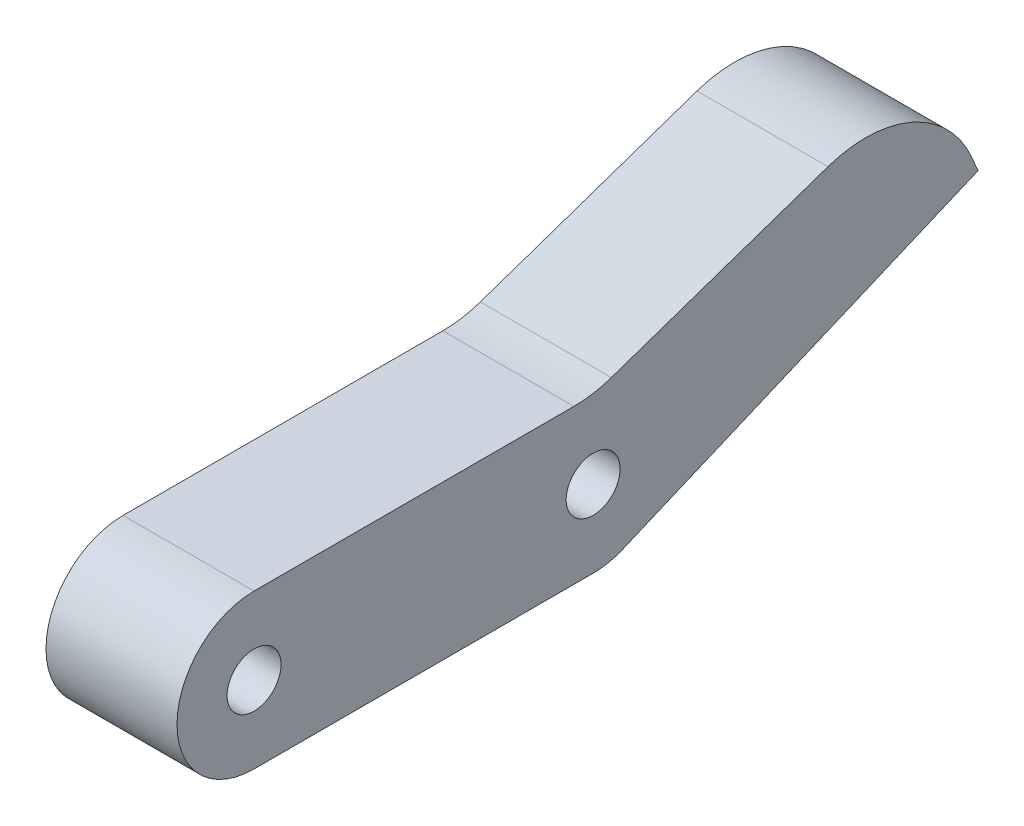
ISO-10303-21;
HEADER;
FILE_DESCRIPTION(('STEP AP214'),'2;1');
FILE_NAME('part.step','',(''),(''),'','','');
FILE_SCHEMA(('AUTOMOTIVE_DESIGN { 1 0 10303 214 1 1 1 1 }'));
ENDSEC;
DATA;
#1=APPLICATION_CONTEXT('core data for automotive mechanical design processes');
#2=APPLICATION_PROTOCOL_DEFINITION('international standard','automotive_design',2000,#1);
#3=PRODUCT_CONTEXT('',#1,'mechanical');
#4=PRODUCT('Part','Part','',(#3));
#5=PRODUCT_RELATED_PRODUCT_CATEGORY('part','',(#4));
#6=PRODUCT_DEFINITION_FORMATION('','',#4);
#7=PRODUCT_DEFINITION_CONTEXT('part definition',#1,'design');
#8=PRODUCT_DEFINITION('design','',#6,#7);
#9=PRODUCT_DEFINITION_SHAPE('','',#8);
#10=(LENGTH_UNIT() NAMED_UNIT(*) SI_UNIT(.MILLI.,.METRE.));
#11=(NAMED_UNIT(*) PLANE_ANGLE_UNIT() SI_UNIT($,.RADIAN.));
#12=(NAMED_UNIT(*) SI_UNIT($,.STERADIAN.) SOLID_ANGLE_UNIT());
#13=UNCERTAINTY_MEASURE_WITH_UNIT(LENGTH_MEASURE(1.E-05),#10,'distance_accuracy_value','');
#14=(GEOMETRIC_REPRESENTATION_CONTEXT(3) GLOBAL_UNCERTAINTY_ASSIGNED_CONTEXT((#13)) GLOBAL_UNIT_ASSIGNED_CONTEXT((#10,
#11,#12)) REPRESENTATION_CONTEXT('',''));
#15=CARTESIAN_POINT('',(0.,0.,0.));
#16=DIRECTION('',(0.,0.,1.));
#17=DIRECTION('',(1.,0.,0.));
#18=AXIS2_PLACEMENT_3D('',#15,#16,#17);
#19=CARTESIAN_POINT('',(8.5,5.,-27.));
#20=DIRECTION('',(-1.,0.,0.));
#21=DIRECTION('',(0.,0.,1.));
#22=AXIS2_PLACEMENT_3D('',#19,#20,#21);
#23=CYLINDRICAL_SURFACE('',#22,5.);
#24=DIRECTION('',(1.,0.,0.));
#25=VECTOR('',#24,1.);
#26=CARTESIAN_POINT('',(-30.2694405121752,0.394752402179554,-28.9472274039693));
#27=LINE('',#26,#25);
#28=CARTESIAN_POINT('',(0.,0.394752402179553,-28.9472274039693));
#29=VERTEX_POINT('',#28);
#30=CARTESIAN_POINT('',(8.5,0.394752402179553,-28.9472274039693));
#31=VERTEX_POINT('',#30);
#32=EDGE_CURVE('E134',#29,#31,#27,.T.);
#33=ORIENTED_EDGE('',*,*,#32,.T.);
#34=CARTESIAN_POINT('',(8.5,5.,-27.));
#35=DIRECTION('',(1.,0.,0.));
#36=DIRECTION('',(0.,0.,-1.));
#37=AXIS2_PLACEMENT_3D('',#34,#35,#36);
#38=CIRCLE('',#37,5.);
#39=CARTESIAN_POINT('',(8.5,0.,-27.));
#40=VERTEX_POINT('',#39);
#41=EDGE_CURVE('E150',#40,#31,#38,.T.);
#42=ORIENTED_EDGE('',*,*,#41,.F.);
#43=DIRECTION('',(-1.,0.,0.));
#44=VECTOR('',#43,1.);
#45=CARTESIAN_POINT('',(8.5,0.,-27.));
#46=LINE('',#45,#44);
#47=CARTESIAN_POINT('',(0.,0.,-27.));
#48=VERTEX_POINT('',#47);
#49=EDGE_CURVE('E184',#40,#48,#46,.T.);
#50=ORIENTED_EDGE('',*,*,#49,.T.);
#51=CARTESIAN_POINT('',(0.,5.,-27.));
#52=DIRECTION('',(1.,0.,0.));
#53=DIRECTION('',(0.,0.,-1.));
#54=AXIS2_PLACEMENT_3D('',#51,#52,#53);
#55=CIRCLE('',#54,5.);
#56=EDGE_CURVE('E193',#48,#29,#55,.T.);
#57=ORIENTED_EDGE('',*,*,#56,.T.);
#58=EDGE_LOOP('',(#33,#42,#50,#57));
#59=FACE_BOUND('',#58,.T.);
#60=ADVANCED_FACE('F47',(#59),#23,.T.);
#61=CARTESIAN_POINT('',(8.5,10.,0.));
#62=DIRECTION('',(0.,1.,0.));
#63=DIRECTION('',(0.,0.,1.));
#64=AXIS2_PLACEMENT_3D('',#61,#62,#63);
#65=PLANE('',#64);
#66=DIRECTION('',(0.,0.,-1.));
#67=VECTOR('',#66,1.);
#68=CARTESIAN_POINT('',(8.5,10.,0.));
#69=LINE('',#68,#67);
#70=CARTESIAN_POINT('',(8.5,10.,-5.));
#71=VERTEX_POINT('',#70);
#72=CARTESIAN_POINT('',(8.5,10.,-25.7491878028435));
#73=VERTEX_POINT('',#72);
#74=EDGE_CURVE('E165',#71,#73,#69,.T.);
#75=ORIENTED_EDGE('',*,*,#74,.T.);
#76=DIRECTION('',(-1.,0.,0.));
#77=VECTOR('',#76,1.);
#78=CARTESIAN_POINT('',(8.5,10.,-25.7491878028435));
#79=LINE('',#78,#77);
#80=CARTESIAN_POINT('',(0.,10.,-25.7491878028435));
#81=VERTEX_POINT('',#80);
#82=EDGE_CURVE('E226',#73,#81,#79,.T.);
#83=ORIENTED_EDGE('',*,*,#82,.T.);
#84=DIRECTION('',(0.,0.,-1.));
#85=VECTOR('',#84,1.);
#86=CARTESIAN_POINT('',(0.,10.,0.));
#87=LINE('',#86,#85);
#88=CARTESIAN_POINT('',(0.,10.,-5.));
#89=VERTEX_POINT('',#88);
#90=EDGE_CURVE('E161',#89,#81,#87,.T.);
#91=ORIENTED_EDGE('',*,*,#90,.F.);
#92=DIRECTION('',(-1.,0.,0.));
#93=VECTOR('',#92,1.);
#94=CARTESIAN_POINT('',(8.5,10.,-5.));
#95=LINE('',#94,#93);
#96=EDGE_CURVE('E214',#71,#89,#95,.T.);
#97=ORIENTED_EDGE('',*,*,#96,.F.);
#98=EDGE_LOOP('',(#75,#83,#91,#97));
#99=FACE_BOUND('',#98,.T.);
#100=ADVANCED_FACE('F241',(#99),#65,.T.);
#101=CARTESIAN_POINT('',(8.5,5.,-5.));
#102=DIRECTION('',(-1.,0.,0.));
#103=DIRECTION('',(0.,0.,1.));
#104=AXIS2_PLACEMENT_3D('',#101,#102,#103);
#105=CYLINDRICAL_SURFACE('',#104,5.);
#106=CARTESIAN_POINT('',(0.,5.,-5.));
#107=DIRECTION('',(1.,0.,0.));
#108=DIRECTION('',(0.,0.,-1.));
#109=AXIS2_PLACEMENT_3D('',#106,#107,#108);
#110=CIRCLE('',#109,5.);
#111=CARTESIAN_POINT('',(0.,0.,-5.));
#112=VERTEX_POINT('',#111);
#113=EDGE_CURVE('E189',#89,#112,#110,.T.);
#114=ORIENTED_EDGE('',*,*,#113,.T.);
#115=DIRECTION('',(-1.,0.,0.));
#116=VECTOR('',#115,1.);
#117=CARTESIAN_POINT('',(8.5,0.,-5.));
#118=LINE('',#117,#116);
#119=CARTESIAN_POINT('',(8.5,0.,-5.));
#120=VERTEX_POINT('',#119);
#121=EDGE_CURVE('E210',#120,#112,#118,.T.);
#122=ORIENTED_EDGE('',*,*,#121,.F.);
#123=CARTESIAN_POINT('',(8.5,5.,-5.));
#124=DIRECTION('',(1.,0.,0.));
#125=DIRECTION('',(0.,0.,-1.));
#126=AXIS2_PLACEMENT_3D('',#123,#124,#125);
#127=CIRCLE('',#126,5.);
#128=EDGE_CURVE('E166',#71,#120,#127,.T.);
#129=ORIENTED_EDGE('',*,*,#128,.F.);
#130=ORIENTED_EDGE('',*,*,#96,.T.);
#131=EDGE_LOOP('',(#114,#122,#129,#130));
#132=FACE_BOUND('',#131,.T.);
#133=ADVANCED_FACE('F250',(#132),#105,.T.);
#134=CARTESIAN_POINT('',(8.5,0.,0.));
#135=DIRECTION('',(0.,1.,0.));
#136=DIRECTION('',(0.,0.,1.));
#137=AXIS2_PLACEMENT_3D('',#134,#135,#136);
#138=PLANE('',#137);
#139=DIRECTION('',(0.,0.,-1.));
#140=VECTOR('',#139,1.);
#141=CARTESIAN_POINT('',(0.,0.,0.));
#142=LINE('',#141,#140);
#143=EDGE_CURVE('E194',#112,#48,#142,.T.);
#144=ORIENTED_EDGE('',*,*,#143,.T.);
#145=ORIENTED_EDGE('',*,*,#49,.F.);
#146=DIRECTION('',(0.,0.,-1.));
#147=VECTOR('',#146,1.);
#148=CARTESIAN_POINT('',(8.5,0.,0.));
#149=LINE('',#148,#147);
#150=EDGE_CURVE('E175',#120,#40,#149,.T.);
#151=ORIENTED_EDGE('',*,*,#150,.F.);
#152=ORIENTED_EDGE('',*,*,#121,.T.);
#153=EDGE_LOOP('',(#144,#145,#151,#152));
#154=FACE_BOUND('',#153,.T.);
#155=ADVANCED_FACE('F252',(#154),#138,.F.);
#156=CARTESIAN_POINT('',(8.5,5.,-5.));
#157=DIRECTION('',(-1.,0.,0.));
#158=DIRECTION('',(0.,0.,1.));
#159=AXIS2_PLACEMENT_3D('',#156,#157,#158);
#160=CYLINDRICAL_SURFACE('',#159,1.75);
#161=CARTESIAN_POINT('',(8.5,5.,-5.));
#162=DIRECTION('',(1.,0.,0.));
#163=DIRECTION('',(0.,0.,-1.));
#164=AXIS2_PLACEMENT_3D('',#161,#162,#163);
#165=CIRCLE('',#164,1.75);
#166=CARTESIAN_POINT('',(8.5,5.,-6.75));
#167=VERTEX_POINT('',#166);
#168=EDGE_CURVE('E180',#167,#167,#165,.T.);
#169=ORIENTED_EDGE('',*,*,#168,.T.);
#170=EDGE_LOOP('',(#169));
#171=FACE_BOUND('',#170,.T.);
#172=CARTESIAN_POINT('',(0.,5.,-5.));
#173=DIRECTION('',(1.,0.,0.));
#174=DIRECTION('',(0.,0.,-1.));
#175=AXIS2_PLACEMENT_3D('',#172,#173,#174);
#176=CIRCLE('',#175,1.75);
#177=CARTESIAN_POINT('',(0.,5.,-6.75));
#178=VERTEX_POINT('',#177);
#179=EDGE_CURVE('E199',#178,#178,#176,.T.);
#180=ORIENTED_EDGE('',*,*,#179,.F.);
#181=EDGE_LOOP('',(#180));
#182=FACE_BOUND('',#181,.T.);
#183=ADVANCED_FACE('F273',(#171,#182),#160,.F.);
#184=CARTESIAN_POINT('',(8.5,5.,-27.));
#185=DIRECTION('',(-1.,0.,0.));
#186=DIRECTION('',(0.,0.,1.));
#187=AXIS2_PLACEMENT_3D('',#184,#185,#186);
#188=CYLINDRICAL_SURFACE('',#187,1.75);
#189=CARTESIAN_POINT('',(8.5,5.,-27.));
#190=DIRECTION('',(1.,0.,0.));
#191=DIRECTION('',(0.,0.,-1.));
#192=AXIS2_PLACEMENT_3D('',#189,#190,#191);
#193=CIRCLE('',#192,1.75);
#194=CARTESIAN_POINT('',(8.5,5.,-28.75));
#195=VERTEX_POINT('',#194);
#196=EDGE_CURVE('E181',#195,#195,#193,.T.);
#197=ORIENTED_EDGE('',*,*,#196,.T.);
#198=EDGE_LOOP('',(#197));
#199=FACE_BOUND('',#198,.T.);
#200=CARTESIAN_POINT('',(0.,5.,-27.));
#201=DIRECTION('',(1.,0.,0.));
#202=DIRECTION('',(0.,0.,-1.));
#203=AXIS2_PLACEMENT_3D('',#200,#201,#202);
#204=CIRCLE('',#203,1.75);
#205=CARTESIAN_POINT('',(0.,5.,-28.75));
#206=VERTEX_POINT('',#205);
#207=EDGE_CURVE('E169',#206,#206,#204,.T.);
#208=ORIENTED_EDGE('',*,*,#207,.F.);
#209=EDGE_LOOP('',(#208));
#210=FACE_BOUND('',#209,.T.);
#211=ADVANCED_FACE('F292',(#199,#210),#188,.F.);
#212=CARTESIAN_POINT('',(8.5,0.,0.));
#213=DIRECTION('',(1.,0.,0.));
#214=DIRECTION('',(0.,0.,-1.));
#215=AXIS2_PLACEMENT_3D('',#212,#213,#214);
#216=PLANE('',#215);
#217=DIRECTION('',(0.,0.921049519564089,0.389445480793859));
#218=VECTOR('',#217,1.);
#219=CARTESIAN_POINT('',(8.5,20.1793374029032,-47.7247007262197));
#220=LINE('',#219,#218);
#221=CARTESIAN_POINT('',(8.5,10.130889422026,-51.9734653930715));
#222=VERTEX_POINT('',#221);
#223=CARTESIAN_POINT('',(8.5,11.0557068269695,-51.5824267450245));
#224=VERTEX_POINT('',#223);
#225=EDGE_CURVE('E136',#222,#224,#220,.T.);
#226=ORIENTED_EDGE('',*,*,#225,.T.);
#227=CARTESIAN_POINT('',(8.5,8.13486572101553,-44.6745553482938));
#228=DIRECTION('',(1.,0.,0.));
#229=DIRECTION('',(0.,0.,-1.));
#230=AXIS2_PLACEMENT_3D('',#227,#228,#229);
#231=CIRCLE('',#230,7.5);
#232=CARTESIAN_POINT('',(8.5,15.2289475751707,-42.2406279363634));
#233=VERTEX_POINT('',#232);
#234=EDGE_CURVE('E218',#224,#233,#231,.T.);
#235=ORIENTED_EDGE('',*,*,#234,.T.);
#236=DIRECTION('',(0.,0.324523654924054,-0.945877580554024));
#237=VECTOR('',#236,1.);
#238=CARTESIAN_POINT('',(8.5,0.658933436040283,0.226075225178936));
#239=LINE('',#238,#237);
#240=CARTESIAN_POINT('',(8.5,10.4059181458448,-28.1831152147739));
#241=VERTEX_POINT('',#240);
#242=EDGE_CURVE('E132',#241,#233,#239,.T.);
#243=ORIENTED_EDGE('',*,*,#242,.F.);
#244=CARTESIAN_POINT('',(8.5,17.5,-25.7491878028435));
#245=DIRECTION('',(1.,0.,0.));
#246=DIRECTION('',(0.,0.,-1.));
#247=AXIS2_PLACEMENT_3D('',#244,#245,#246);
#248=CIRCLE('',#247,7.5);
#249=EDGE_CURVE('E11',#241,#73,#248,.F.);
#250=ORIENTED_EDGE('',*,*,#249,.T.);
#251=ORIENTED_EDGE('',*,*,#74,.F.);
#252=ORIENTED_EDGE('',*,*,#128,.T.);
#253=ORIENTED_EDGE('',*,*,#150,.T.);
#254=ORIENTED_EDGE('',*,*,#41,.T.);
#255=DIRECTION('',(0.,0.38944548079386,-0.921049519564089));
#256=VECTOR('',#255,1.);
#257=CARTESIAN_POINT('',(8.5,-10.0484479808772,-4.24876466685188));
#258=LINE('',#257,#256);
#259=EDGE_CURVE('E129',#31,#222,#258,.T.);
#260=ORIENTED_EDGE('',*,*,#259,.T.);
#261=EDGE_LOOP('',(#226,#235,#243,#250,#251,#252,#253,#254,#260));
#262=FACE_BOUND('',#261,.T.);
#263=ORIENTED_EDGE('',*,*,#168,.F.);
#264=EDGE_LOOP('',(#263));
#265=FACE_BOUND('',#264,.T.);
#266=ORIENTED_EDGE('',*,*,#196,.F.);
#267=EDGE_LOOP('',(#266));
#268=FACE_BOUND('',#267,.T.);
#269=ADVANCED_FACE('F143',(#262,#265,#268),#216,.T.);
#270=CARTESIAN_POINT('',(0.,0.,0.));
#271=DIRECTION('',(1.,0.,0.));
#272=DIRECTION('',(0.,0.,-1.));
#273=AXIS2_PLACEMENT_3D('',#270,#271,#272);
#274=PLANE('',#273);
#275=DIRECTION('',(0.,-0.324523654924054,0.945877580554024));
#276=VECTOR('',#275,1.);
#277=CARTESIAN_POINT('',(0.,0.658933436040283,0.226075225178936));
#278=LINE('',#277,#276);
#279=CARTESIAN_POINT('',(0.,15.2289475751707,-42.2406279363634));
#280=VERTEX_POINT('',#279);
#281=CARTESIAN_POINT('',(0.,10.4059181458448,-28.1831152147739));
#282=VERTEX_POINT('',#281);
#283=EDGE_CURVE('E160',#280,#282,#278,.T.);
#284=ORIENTED_EDGE('',*,*,#283,.F.);
#285=CARTESIAN_POINT('',(0.,8.13486572101553,-44.6745553482938));
#286=DIRECTION('',(1.,0.,0.));
#287=DIRECTION('',(0.,0.,-1.));
#288=AXIS2_PLACEMENT_3D('',#285,#286,#287);
#289=CIRCLE('',#288,7.5);
#290=CARTESIAN_POINT('',(0.,11.0557068269695,-51.5824267450245));
#291=VERTEX_POINT('',#290);
#292=EDGE_CURVE('E222',#280,#291,#289,.F.);
#293=ORIENTED_EDGE('',*,*,#292,.T.);
#294=DIRECTION('',(0.,-0.921049519564089,-0.389445480793859));
#295=VECTOR('',#294,1.);
#296=CARTESIAN_POINT('',(0.,20.1793374029032,-47.7247007262197));
#297=LINE('',#296,#295);
#298=CARTESIAN_POINT('',(0.,10.130889422026,-51.9734653930715));
#299=VERTEX_POINT('',#298);
#300=EDGE_CURVE('E157',#291,#299,#297,.T.);
#301=ORIENTED_EDGE('',*,*,#300,.T.);
#302=DIRECTION('',(0.,-0.38944548079386,0.921049519564089));
#303=VECTOR('',#302,1.);
#304=CARTESIAN_POINT('',(0.,-10.0484479808772,-4.24876466685188));
#305=LINE('',#304,#303);
#306=EDGE_CURVE('E130',#299,#29,#305,.T.);
#307=ORIENTED_EDGE('',*,*,#306,.T.);
#308=ORIENTED_EDGE('',*,*,#56,.F.);
#309=ORIENTED_EDGE('',*,*,#143,.F.);
#310=ORIENTED_EDGE('',*,*,#113,.F.);
#311=ORIENTED_EDGE('',*,*,#90,.T.);
#312=CARTESIAN_POINT('',(0.,17.5,-25.7491878028435));
#313=DIRECTION('',(1.,0.,0.));
#314=DIRECTION('',(0.,0.,-1.));
#315=AXIS2_PLACEMENT_3D('',#312,#313,#314);
#316=CIRCLE('',#315,7.5);
#317=EDGE_CURVE('E59',#81,#282,#316,.T.);
#318=ORIENTED_EDGE('',*,*,#317,.T.);
#319=EDGE_LOOP('',(#284,#293,#301,#307,#308,#309,#310,#311,#318));
#320=FACE_BOUND('',#319,.T.);
#321=ORIENTED_EDGE('',*,*,#179,.T.);
#322=EDGE_LOOP('',(#321));
#323=FACE_BOUND('',#322,.T.);
#324=ORIENTED_EDGE('',*,*,#207,.T.);
#325=EDGE_LOOP('',(#324));
#326=FACE_BOUND('',#325,.T.);
#327=ADVANCED_FACE('F253',(#320,#323,#326),#274,.F.);
#328=CARTESIAN_POINT('',(-30.2694405121752,-10.0484479808772,-4.24876466685188));
#329=DIRECTION('',(0.,-0.921049519564089,-0.38944548079386));
#330=DIRECTION('',(0.,0.38944548079386,-0.921049519564089));
#331=AXIS2_PLACEMENT_3D('',#328,#329,#330);
#332=PLANE('',#331);
#333=ORIENTED_EDGE('',*,*,#306,.F.);
#334=DIRECTION('',(1.,0.,0.));
#335=VECTOR('',#334,1.);
#336=CARTESIAN_POINT('',(-30.2694405121752,10.130889422026,-51.9734653930715));
#337=LINE('',#336,#335);
#338=EDGE_CURVE('E122',#299,#222,#337,.T.);
#339=ORIENTED_EDGE('',*,*,#338,.T.);
#340=ORIENTED_EDGE('',*,*,#259,.F.);
#341=ORIENTED_EDGE('',*,*,#32,.F.);
#342=EDGE_LOOP('',(#333,#339,#340,#341));
#343=FACE_BOUND('',#342,.T.);
#344=ADVANCED_FACE('F124',(#343),#332,.T.);
#345=CARTESIAN_POINT('',(-30.2694405121752,0.658933436040283,0.226075225178936));
#346=DIRECTION('',(0.,-0.945877580554024,-0.324523654924054));
#347=DIRECTION('',(0.,0.324523654924054,-0.945877580554024));
#348=AXIS2_PLACEMENT_3D('',#345,#346,#347);
#349=PLANE('',#348);
#350=ORIENTED_EDGE('',*,*,#242,.T.);
#351=DIRECTION('',(1.,0.,0.));
#352=VECTOR('',#351,1.);
#353=CARTESIAN_POINT('',(0.,15.2289475751707,-42.2406279363634));
#354=LINE('',#353,#352);
#355=EDGE_CURVE('E221',#233,#280,#354,.F.);
#356=ORIENTED_EDGE('',*,*,#355,.T.);
#357=ORIENTED_EDGE('',*,*,#283,.T.);
#358=DIRECTION('',(-1.,0.,0.));
#359=VECTOR('',#358,1.);
#360=CARTESIAN_POINT('',(-30.2694405121752,10.4059181458448,-28.1831152147739));
#361=LINE('',#360,#359);
#362=EDGE_CURVE('E220',#282,#241,#361,.F.);
#363=ORIENTED_EDGE('',*,*,#362,.T.);
#364=EDGE_LOOP('',(#350,#356,#357,#363));
#365=FACE_BOUND('',#364,.T.);
#366=ADVANCED_FACE('F234',(#365),#349,.F.);
#367=CARTESIAN_POINT('',(-30.2694405121752,20.1793374029032,-47.7247007262197));
#368=DIRECTION('',(0.,0.389445480793859,-0.921049519564089));
#369=DIRECTION('',(0.,0.921049519564089,0.389445480793859));
#370=AXIS2_PLACEMENT_3D('',#367,#368,#369);
#371=PLANE('',#370);
#372=ORIENTED_EDGE('',*,*,#300,.F.);
#373=DIRECTION('',(1.,0.,0.));
#374=VECTOR('',#373,1.);
#375=CARTESIAN_POINT('',(8.5,11.0557068269695,-51.5824267450245));
#376=LINE('',#375,#374);
#377=EDGE_CURVE('E137',#291,#224,#376,.T.);
#378=ORIENTED_EDGE('',*,*,#377,.T.);
#379=ORIENTED_EDGE('',*,*,#225,.F.);
#380=ORIENTED_EDGE('',*,*,#338,.F.);
#381=EDGE_LOOP('',(#372,#378,#379,#380));
#382=FACE_BOUND('',#381,.T.);
#383=ADVANCED_FACE('F140',(#382),#371,.T.);
#384=CARTESIAN_POINT('',(-30.2694405121752,8.13486572101553,-44.6745553482938));
#385=DIRECTION('',(-1.,0.,0.));
#386=DIRECTION('',(0.,0.,1.));
#387=AXIS2_PLACEMENT_3D('',#384,#385,#386);
#388=CYLINDRICAL_SURFACE('',#387,7.5);
#389=ORIENTED_EDGE('',*,*,#292,.F.);
#390=ORIENTED_EDGE('',*,*,#355,.F.);
#391=ORIENTED_EDGE('',*,*,#234,.F.);
#392=ORIENTED_EDGE('',*,*,#377,.F.);
#393=EDGE_LOOP('',(#389,#390,#391,#392));
#394=FACE_BOUND('',#393,.T.);
#395=ADVANCED_FACE('F260',(#394),#388,.T.);
#396=CARTESIAN_POINT('',(8.5,17.5,-25.7491878028435));
#397=DIRECTION('',(-1.,0.,0.));
#398=DIRECTION('',(0.,0.,1.));
#399=AXIS2_PLACEMENT_3D('',#396,#397,#398);
#400=CYLINDRICAL_SURFACE('',#399,7.5);
#401=ORIENTED_EDGE('',*,*,#249,.F.);
#402=ORIENTED_EDGE('',*,*,#362,.F.);
#403=ORIENTED_EDGE('',*,*,#317,.F.);
#404=ORIENTED_EDGE('',*,*,#82,.F.);
#405=EDGE_LOOP('',(#401,#402,#403,#404));
#406=FACE_BOUND('',#405,.T.);
#407=ADVANCED_FACE('F51',(#406),#400,.F.);
#408=CLOSED_SHELL('',(#60,#100,#133,#155,#183,#211,#269,#327,#344,#366,#383,#395,#407));
#409=MANIFOLD_SOLID_BREP('B2',#408);
#410=ADVANCED_BREP_SHAPE_REPRESENTATION('',(#18,#409),#14);
#411=SHAPE_DEFINITION_REPRESENTATION(#9,#410);
ENDSEC;
END-ISO-10303-21;
